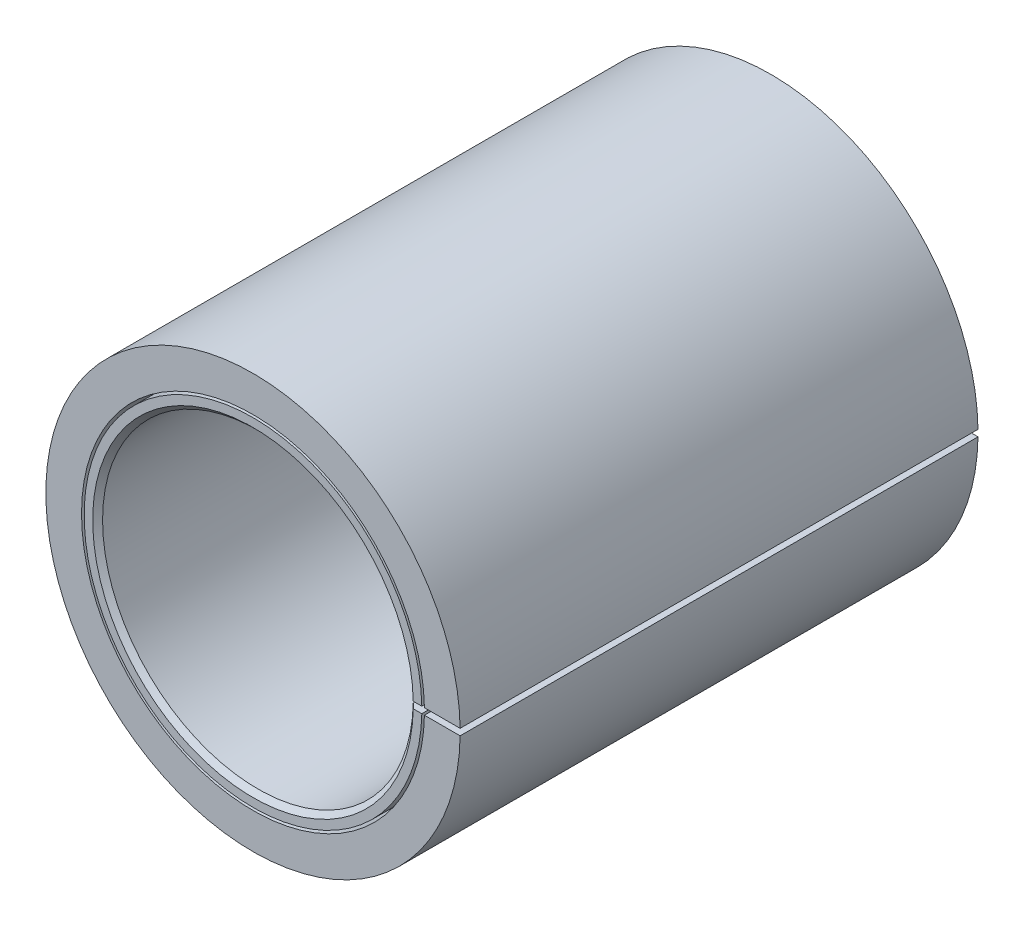
ISO-10303-21;
HEADER;
FILE_DESCRIPTION(('STEP AP214'),'2;1');
FILE_NAME('part.step','',(''),(''),'','','');
FILE_SCHEMA(('AUTOMOTIVE_DESIGN { 1 0 10303 214 1 1 1 1 }'));
ENDSEC;
DATA;
#1=APPLICATION_CONTEXT('core data for automotive mechanical design processes');
#2=APPLICATION_PROTOCOL_DEFINITION('international standard','automotive_design',2000,#1);
#3=PRODUCT_CONTEXT('',#1,'mechanical');
#4=PRODUCT('Part','Part','',(#3));
#5=PRODUCT_RELATED_PRODUCT_CATEGORY('part','',(#4));
#6=PRODUCT_DEFINITION_FORMATION('','',#4);
#7=PRODUCT_DEFINITION_CONTEXT('part definition',#1,'design');
#8=PRODUCT_DEFINITION('design','',#6,#7);
#9=PRODUCT_DEFINITION_SHAPE('','',#8);
#10=(LENGTH_UNIT() NAMED_UNIT(*) SI_UNIT(.MILLI.,.METRE.));
#11=(NAMED_UNIT(*) PLANE_ANGLE_UNIT() SI_UNIT($,.RADIAN.));
#12=(NAMED_UNIT(*) SI_UNIT($,.STERADIAN.) SOLID_ANGLE_UNIT());
#13=UNCERTAINTY_MEASURE_WITH_UNIT(LENGTH_MEASURE(1.E-05),#10,'distance_accuracy_value','');
#14=(GEOMETRIC_REPRESENTATION_CONTEXT(3) GLOBAL_UNCERTAINTY_ASSIGNED_CONTEXT((#13)) GLOBAL_UNIT_ASSIGNED_CONTEXT((#10,
#11,#12)) REPRESENTATION_CONTEXT('',''));
#15=CARTESIAN_POINT('',(0.,0.,0.));
#16=DIRECTION('',(0.,0.,1.));
#17=DIRECTION('',(1.,0.,0.));
#18=AXIS2_PLACEMENT_3D('',#15,#16,#17);
#19=CARTESIAN_POINT('',(0.,0.,5.));
#20=DIRECTION('',(0.,0.,-1.));
#21=DIRECTION('',(-1.,0.,0.));
#22=AXIS2_PLACEMENT_3D('',#19,#20,#21);
#23=CYLINDRICAL_SURFACE('',#22,4.);
#24=CARTESIAN_POINT('',(0.,0.,-5.));
#25=DIRECTION('',(0.,0.,1.));
#26=DIRECTION('',(1.,0.,0.));
#27=AXIS2_PLACEMENT_3D('',#24,#25,#26);
#28=CIRCLE('',#27,4.);
#29=CARTESIAN_POINT('',(3.99951168894404,0.0625,-5.));
#30=VERTEX_POINT('',#29);
#31=CARTESIAN_POINT('',(3.99951168894404,-0.0625,-5.));
#32=VERTEX_POINT('',#31);
#33=EDGE_CURVE('E115',#30,#32,#28,.T.);
#34=ORIENTED_EDGE('',*,*,#33,.T.);
#35=DIRECTION('',(0.,0.,-1.));
#36=VECTOR('',#35,1.);
#37=CARTESIAN_POINT('',(3.99951168894404,-0.0625,5.));
#38=LINE('',#37,#36);
#39=CARTESIAN_POINT('',(3.99951168894404,-0.0625,5.));
#40=VERTEX_POINT('',#39);
#41=EDGE_CURVE('E122',#32,#40,#38,.F.);
#42=ORIENTED_EDGE('',*,*,#41,.T.);
#43=CARTESIAN_POINT('',(0.,0.,5.));
#44=DIRECTION('',(0.,0.,1.));
#45=DIRECTION('',(1.,0.,0.));
#46=AXIS2_PLACEMENT_3D('',#43,#44,#45);
#47=CIRCLE('',#46,4.);
#48=CARTESIAN_POINT('',(3.99951168894404,0.0625,5.));
#49=VERTEX_POINT('',#48);
#50=EDGE_CURVE('E112',#49,#40,#47,.T.);
#51=ORIENTED_EDGE('',*,*,#50,.F.);
#52=DIRECTION('',(0.,0.,-1.));
#53=VECTOR('',#52,1.);
#54=CARTESIAN_POINT('',(3.99951168894404,0.0625,5.));
#55=LINE('',#54,#53);
#56=EDGE_CURVE('E125',#30,#49,#55,.F.);
#57=ORIENTED_EDGE('',*,*,#56,.F.);
#58=EDGE_LOOP('',(#34,#42,#51,#57));
#59=FACE_BOUND('',#58,.T.);
#60=ADVANCED_FACE('F61',(#59),#23,.T.);
#61=CARTESIAN_POINT('',(0.,0.,5.));
#62=DIRECTION('',(0.,0.,1.));
#63=DIRECTION('',(1.,0.,0.));
#64=AXIS2_PLACEMENT_3D('',#61,#62,#63);
#65=PLANE('',#64);
#66=DIRECTION('',(1.,0.,0.));
#67=VECTOR('',#66,1.);
#68=CARTESIAN_POINT('',(0.,-0.0625,5.));
#69=LINE('',#68,#67);
#70=CARTESIAN_POINT('',(3.31052436376191,-0.0625,5.));
#71=VERTEX_POINT('',#70);
#72=EDGE_CURVE('E100',#71,#40,#69,.T.);
#73=ORIENTED_EDGE('',*,*,#72,.F.);
#74=CARTESIAN_POINT('',(0.,0.,5.));
#75=DIRECTION('',(0.,0.,1.));
#76=DIRECTION('',(1.,0.,0.));
#77=AXIS2_PLACEMENT_3D('',#74,#75,#76);
#78=CIRCLE('',#77,3.31111428571429);
#79=CARTESIAN_POINT('',(3.31052436376191,0.0625,5.));
#80=VERTEX_POINT('',#79);
#81=EDGE_CURVE('E110',#80,#71,#78,.T.);
#82=ORIENTED_EDGE('',*,*,#81,.F.);
#83=DIRECTION('',(1.,0.,0.));
#84=VECTOR('',#83,1.);
#85=CARTESIAN_POINT('',(0.,0.0625,5.));
#86=LINE('',#85,#84);
#87=EDGE_CURVE('E76',#80,#49,#86,.T.);
#88=ORIENTED_EDGE('',*,*,#87,.T.);
#89=ORIENTED_EDGE('',*,*,#50,.T.);
#90=EDGE_LOOP('',(#73,#82,#88,#89));
#91=FACE_BOUND('',#90,.T.);
#92=ADVANCED_FACE('F109',(#91),#65,.T.);
#93=CARTESIAN_POINT('',(0.,0.,-5.));
#94=DIRECTION('',(0.,0.,1.));
#95=DIRECTION('',(1.,0.,0.));
#96=AXIS2_PLACEMENT_3D('',#93,#94,#95);
#97=PLANE('',#96);
#98=CARTESIAN_POINT('',(0.,0.,-5.));
#99=DIRECTION('',(0.,0.,1.));
#100=DIRECTION('',(1.,0.,0.));
#101=AXIS2_PLACEMENT_3D('',#98,#99,#100);
#102=CIRCLE('',#101,3.31111428571429);
#103=CARTESIAN_POINT('',(3.31052436376191,0.0625,-5.));
#104=VERTEX_POINT('',#103);
#105=CARTESIAN_POINT('',(3.31052436376191,-0.0625,-5.));
#106=VERTEX_POINT('',#105);
#107=EDGE_CURVE('E118',#104,#106,#102,.T.);
#108=ORIENTED_EDGE('',*,*,#107,.T.);
#109=DIRECTION('',(1.,0.,0.));
#110=VECTOR('',#109,1.);
#111=CARTESIAN_POINT('',(0.,-0.0625,-5.));
#112=LINE('',#111,#110);
#113=EDGE_CURVE('E84',#106,#32,#112,.T.);
#114=ORIENTED_EDGE('',*,*,#113,.T.);
#115=ORIENTED_EDGE('',*,*,#33,.F.);
#116=DIRECTION('',(1.,0.,0.));
#117=VECTOR('',#116,1.);
#118=CARTESIAN_POINT('',(0.,0.0625,-5.));
#119=LINE('',#118,#117);
#120=EDGE_CURVE('E127',#104,#30,#119,.T.);
#121=ORIENTED_EDGE('',*,*,#120,.F.);
#122=EDGE_LOOP('',(#108,#114,#115,#121));
#123=FACE_BOUND('',#122,.T.);
#124=ADVANCED_FACE('F63',(#123),#97,.F.);
#125=CARTESIAN_POINT('',(0.,0.,-5.));
#126=DIRECTION('',(0.,0.,1.));
#127=DIRECTION('',(1.,0.,0.));
#128=AXIS2_PLACEMENT_3D('',#125,#126,#127);
#129=CYLINDRICAL_SURFACE('',#128,3.31111428571429);
#130=ORIENTED_EDGE('',*,*,#81,.T.);
#131=DIRECTION('',(0.,0.,1.));
#132=VECTOR('',#131,1.);
#133=CARTESIAN_POINT('',(3.31052436376191,-0.0625,-5.));
#134=LINE('',#133,#132);
#135=EDGE_CURVE('E13',#71,#106,#134,.F.);
#136=ORIENTED_EDGE('',*,*,#135,.T.);
#137=ORIENTED_EDGE('',*,*,#107,.F.);
#138=DIRECTION('',(0.,0.,1.));
#139=VECTOR('',#138,1.);
#140=CARTESIAN_POINT('',(3.31052436376191,0.0625,-5.));
#141=LINE('',#140,#139);
#142=EDGE_CURVE('E69',#80,#104,#141,.F.);
#143=ORIENTED_EDGE('',*,*,#142,.F.);
#144=EDGE_LOOP('',(#130,#136,#137,#143));
#145=FACE_BOUND('',#144,.T.);
#146=ADVANCED_FACE('F114',(#145),#129,.F.);
#147=CARTESIAN_POINT('',(0.,0.0625,-5.));
#148=DIRECTION('',(0.,-1.,0.));
#149=DIRECTION('',(0.,0.,-1.));
#150=AXIS2_PLACEMENT_3D('',#147,#148,#149);
#151=PLANE('',#150);
#152=ORIENTED_EDGE('',*,*,#56,.T.);
#153=ORIENTED_EDGE('',*,*,#87,.F.);
#154=ORIENTED_EDGE('',*,*,#142,.T.);
#155=ORIENTED_EDGE('',*,*,#120,.T.);
#156=EDGE_LOOP('',(#152,#153,#154,#155));
#157=FACE_BOUND('',#156,.T.);
#158=ADVANCED_FACE('F135',(#157),#151,.T.);
#159=CARTESIAN_POINT('',(0.,-0.0625,-5.));
#160=DIRECTION('',(0.,-1.,0.));
#161=DIRECTION('',(0.,0.,-1.));
#162=AXIS2_PLACEMENT_3D('',#159,#160,#161);
#163=PLANE('',#162);
#164=ORIENTED_EDGE('',*,*,#113,.F.);
#165=ORIENTED_EDGE('',*,*,#135,.F.);
#166=ORIENTED_EDGE('',*,*,#72,.T.);
#167=ORIENTED_EDGE('',*,*,#41,.F.);
#168=EDGE_LOOP('',(#164,#165,#166,#167));
#169=FACE_BOUND('',#168,.T.);
#170=ADVANCED_FACE('F99',(#169),#163,.F.);
#171=CLOSED_SHELL('',(#60,#92,#124,#146,#158,#170));
#172=MANIFOLD_SOLID_BREP('B2',#171);
#173=CARTESIAN_POINT('',(0.,0.,5.));
#174=DIRECTION('',(0.,0.,1.));
#175=DIRECTION('',(1.,0.,0.));
#176=AXIS2_PLACEMENT_3D('',#173,#174,#175);
#177=PLANE('',#176);
#178=DIRECTION('',(1.,0.,0.));
#179=VECTOR('',#178,1.);
#180=CARTESIAN_POINT('',(0.,-0.0625,5.));
#181=LINE('',#180,#179);
#182=CARTESIAN_POINT('',(3.09460702128932,-0.0625,5.));
#183=VERTEX_POINT('',#182);
#184=CARTESIAN_POINT('',(3.25971517032281,-0.0625,5.));
#185=VERTEX_POINT('',#184);
#186=EDGE_CURVE('E242',#183,#185,#181,.T.);
#187=ORIENTED_EDGE('',*,*,#186,.F.);
#188=CARTESIAN_POINT('',(0.,0.,5.));
#189=DIRECTION('',(0.,0.,1.));
#190=DIRECTION('',(1.,0.,0.));
#191=AXIS2_PLACEMENT_3D('',#188,#189,#190);
#192=CIRCLE('',#191,3.0952380952381);
#193=CARTESIAN_POINT('',(3.09460702128932,0.0625,5.));
#194=VERTEX_POINT('',#193);
#195=EDGE_CURVE('E251',#183,#194,#192,.F.);
#196=ORIENTED_EDGE('',*,*,#195,.T.);
#197=DIRECTION('',(1.,0.,0.));
#198=VECTOR('',#197,1.);
#199=CARTESIAN_POINT('',(0.,0.0625,5.));
#200=LINE('',#199,#198);
#201=CARTESIAN_POINT('',(3.25971517032281,0.0625,5.));
#202=VERTEX_POINT('',#201);
#203=EDGE_CURVE('E213',#194,#202,#200,.T.);
#204=ORIENTED_EDGE('',*,*,#203,.T.);
#205=CARTESIAN_POINT('',(0.,0.,5.));
#206=DIRECTION('',(0.,0.,1.));
#207=DIRECTION('',(1.,0.,0.));
#208=AXIS2_PLACEMENT_3D('',#205,#206,#207);
#209=CIRCLE('',#208,3.26031428571429);
#210=EDGE_CURVE('E253',#202,#185,#209,.T.);
#211=ORIENTED_EDGE('',*,*,#210,.T.);
#212=EDGE_LOOP('',(#187,#196,#204,#211));
#213=FACE_BOUND('',#212,.T.);
#214=ADVANCED_FACE('F185',(#213),#177,.T.);
#215=CARTESIAN_POINT('',(0.,0.,5.));
#216=DIRECTION('',(0.,0.,-1.));
#217=DIRECTION('',(-1.,0.,0.));
#218=AXIS2_PLACEMENT_3D('',#215,#216,#217);
#219=CYLINDRICAL_SURFACE('',#218,3.);
#220=DIRECTION('',(0.,0.,-1.));
#221=VECTOR('',#220,1.);
#222=CARTESIAN_POINT('',(2.99934888767546,-0.0625,5.));
#223=LINE('',#222,#221);
#224=CARTESIAN_POINT('',(2.99934888767546,-0.0625,-4.90476190476191));
#225=VERTEX_POINT('',#224);
#226=CARTESIAN_POINT('',(2.99934888767546,-0.0625,4.9047619047619));
#227=VERTEX_POINT('',#226);
#228=EDGE_CURVE('E205',#225,#227,#223,.F.);
#229=ORIENTED_EDGE('',*,*,#228,.F.);
#230=CARTESIAN_POINT('',(0.,0.,-4.90476190476191));
#231=DIRECTION('',(0.,0.,1.));
#232=DIRECTION('',(1.,0.,0.));
#233=AXIS2_PLACEMENT_3D('',#230,#231,#232);
#234=CIRCLE('',#233,3.);
#235=CARTESIAN_POINT('',(2.99934888767546,0.0625,-4.90476190476191));
#236=VERTEX_POINT('',#235);
#237=EDGE_CURVE('E255',#225,#236,#234,.F.);
#238=ORIENTED_EDGE('',*,*,#237,.T.);
#239=DIRECTION('',(0.,0.,-1.));
#240=VECTOR('',#239,1.);
#241=CARTESIAN_POINT('',(2.99934888767546,0.0625,5.));
#242=LINE('',#241,#240);
#243=CARTESIAN_POINT('',(2.99934888767546,0.0625,4.9047619047619));
#244=VERTEX_POINT('',#243);
#245=EDGE_CURVE('E282',#236,#244,#242,.F.);
#246=ORIENTED_EDGE('',*,*,#245,.T.);
#247=CARTESIAN_POINT('',(0.,0.,4.9047619047619));
#248=DIRECTION('',(0.,0.,1.));
#249=DIRECTION('',(1.,0.,0.));
#250=AXIS2_PLACEMENT_3D('',#247,#248,#249);
#251=CIRCLE('',#250,3.);
#252=EDGE_CURVE('E258',#244,#227,#251,.T.);
#253=ORIENTED_EDGE('',*,*,#252,.T.);
#254=EDGE_LOOP('',(#229,#238,#246,#253));
#255=FACE_BOUND('',#254,.T.);
#256=ADVANCED_FACE('F311',(#255),#219,.F.);
#257=CARTESIAN_POINT('',(0.,0.,-5.));
#258=DIRECTION('',(0.,0.,1.));
#259=DIRECTION('',(1.,0.,0.));
#260=AXIS2_PLACEMENT_3D('',#257,#258,#259);
#261=PLANE('',#260);
#262=CARTESIAN_POINT('',(0.,0.,-5.));
#263=DIRECTION('',(0.,0.,1.));
#264=DIRECTION('',(1.,0.,0.));
#265=AXIS2_PLACEMENT_3D('',#262,#263,#264);
#266=CIRCLE('',#265,3.09523809523809);
#267=CARTESIAN_POINT('',(3.09460702128932,0.0625,-5.));
#268=VERTEX_POINT('',#267);
#269=CARTESIAN_POINT('',(3.09460702128932,-0.0625,-5.));
#270=VERTEX_POINT('',#269);
#271=EDGE_CURVE('E307',#268,#270,#266,.T.);
#272=ORIENTED_EDGE('',*,*,#271,.T.);
#273=DIRECTION('',(1.,0.,0.));
#274=VECTOR('',#273,1.);
#275=CARTESIAN_POINT('',(0.,-0.0625,-5.));
#276=LINE('',#275,#274);
#277=CARTESIAN_POINT('',(3.25971517032281,-0.0625,-5.));
#278=VERTEX_POINT('',#277);
#279=EDGE_CURVE('E314',#270,#278,#276,.T.);
#280=ORIENTED_EDGE('',*,*,#279,.T.);
#281=CARTESIAN_POINT('',(0.,0.,-5.));
#282=DIRECTION('',(0.,0.,1.));
#283=DIRECTION('',(1.,0.,0.));
#284=AXIS2_PLACEMENT_3D('',#281,#282,#283);
#285=CIRCLE('',#284,3.26031428571429);
#286=CARTESIAN_POINT('',(3.25971517032281,0.0625,-5.));
#287=VERTEX_POINT('',#286);
#288=EDGE_CURVE('E304',#287,#278,#285,.T.);
#289=ORIENTED_EDGE('',*,*,#288,.F.);
#290=DIRECTION('',(1.,0.,0.));
#291=VECTOR('',#290,1.);
#292=CARTESIAN_POINT('',(0.,0.0625,-5.));
#293=LINE('',#292,#291);
#294=EDGE_CURVE('E313',#268,#287,#293,.T.);
#295=ORIENTED_EDGE('',*,*,#294,.F.);
#296=EDGE_LOOP('',(#272,#280,#289,#295));
#297=FACE_BOUND('',#296,.T.);
#298=ADVANCED_FACE('F291',(#297),#261,.F.);
#299=CARTESIAN_POINT('',(0.,0.,-5.));
#300=DIRECTION('',(0.,0.,1.));
#301=DIRECTION('',(1.,0.,0.));
#302=AXIS2_PLACEMENT_3D('',#299,#300,#301);
#303=CYLINDRICAL_SURFACE('',#302,3.26031428571429);
#304=DIRECTION('',(0.,0.,1.));
#305=VECTOR('',#304,1.);
#306=CARTESIAN_POINT('',(3.25971517032281,-0.0625,-5.));
#307=LINE('',#306,#305);
#308=EDGE_CURVE('E301',#185,#278,#307,.F.);
#309=ORIENTED_EDGE('',*,*,#308,.F.);
#310=ORIENTED_EDGE('',*,*,#210,.F.);
#311=DIRECTION('',(0.,0.,1.));
#312=VECTOR('',#311,1.);
#313=CARTESIAN_POINT('',(3.25971517032281,0.0625,-5.));
#314=LINE('',#313,#312);
#315=EDGE_CURVE('E281',#202,#287,#314,.F.);
#316=ORIENTED_EDGE('',*,*,#315,.T.);
#317=ORIENTED_EDGE('',*,*,#288,.T.);
#318=EDGE_LOOP('',(#309,#310,#316,#317));
#319=FACE_BOUND('',#318,.T.);
#320=ADVANCED_FACE('F289',(#319),#303,.T.);
#321=CARTESIAN_POINT('',(0.,0.,-5.));
#322=DIRECTION('',(0.,0.,-1.));
#323=DIRECTION('',(-1.,0.,0.));
#324=AXIS2_PLACEMENT_3D('',#321,#322,#323);
#325=CONICAL_SURFACE('',#324,3.09523809523809,0.785398163397444);
#326=CARTESIAN_POINT('',(5.26222409702876,-0.0625,-7.16735714830385));
#327=CARTESIAN_POINT('',(4.86479746802348,-0.0625,-6.76996507359462));
#328=CARTESIAN_POINT('',(4.46737332790101,-0.0625,-6.37257050789148));
#329=CARTESIAN_POINT('',(3.67251007557288,-0.0625,-5.5777964288599));
#330=CARTESIAN_POINT('',(3.27507096336869,-0.0625,-5.18041691552997));
#331=CARTESIAN_POINT('',(2.67888600283048,-0.0625,-4.58437385980832));
#332=CARTESIAN_POINT('',(2.48015327960072,-0.0625,-4.38569718927698));
#333=CARTESIAN_POINT('',(2.08266996756869,-0.0625,-3.98836175374139));
#334=CARTESIAN_POINT('',(1.88391937876799,-0.0625,-3.78970298873556));
#335=CARTESIAN_POINT('',(1.58575964545878,-0.0625,-3.49174863613599));
#336=CARTESIAN_POINT('',(1.48636740683474,-0.0625,-3.39243613193995));
#337=CARTESIAN_POINT('',(1.28756202169668,-0.0625,-3.19383207966167));
#338=CARTESIAN_POINT('',(1.18814887518563,-0.0625,-3.09454053157648));
#339=CARTESIAN_POINT('',(0.989281413520054,-0.0625,-2.8959985602955));
#340=CARTESIAN_POINT('',(0.889827098344636,-0.0625,-2.79674813712063));
#341=CARTESIAN_POINT('',(0.740567376446871,-0.0625,-2.6479508971981));
#342=CARTESIAN_POINT('',(0.690801080663394,-0.0625,-2.59836486947287));
#343=CARTESIAN_POINT('',(0.591210998742803,-0.0625,-2.499250540729));
#344=CARTESIAN_POINT('',(0.541387212575795,-0.0625,-2.44972223974041));
#345=CARTESIAN_POINT('',(0.49151899890398,-0.0625,-2.400238620949));
#346=B_SPLINE_CURVE_WITH_KNOTS('',3,(#326,#327,#328,#329,#330,#331,#332,#333,#334,#335,#336,
#337,#338,#339,#340,#341,#342,#343,#344,#345),.UNSPECIFIED.,.F.,.F.,(4,2,2,2,2,2,2,2,2,4),(0.,
1.68606508968482,3.37213001315253,4.21516265313958,5.05819521891096,5.47971166436337,
5.90122805018618,6.32274465010214,6.53350306540142,6.74426159034229),.UNSPECIFIED.);
#347=EDGE_CURVE('E295',#270,#225,#346,.T.);
#348=ORIENTED_EDGE('',*,*,#347,.F.);
#349=ORIENTED_EDGE('',*,*,#271,.F.);
#350=CARTESIAN_POINT('',(5.26222409702876,0.0625,-7.16735714830385));
#351=CARTESIAN_POINT('',(4.86479746802348,0.0625,-6.76996507359462));
#352=CARTESIAN_POINT('',(4.46737332790101,0.0625,-6.37257050789148));
#353=CARTESIAN_POINT('',(3.67251007557288,0.0625,-5.5777964288599));
#354=CARTESIAN_POINT('',(3.27507096336869,0.0625,-5.18041691552997));
#355=CARTESIAN_POINT('',(2.67888600283048,0.0625,-4.58437385980832));
#356=CARTESIAN_POINT('',(2.48015327960072,0.0625,-4.38569718927698));
#357=CARTESIAN_POINT('',(2.08266996756869,0.0625,-3.98836175374139));
#358=CARTESIAN_POINT('',(1.88391937876799,0.0625,-3.78970298873556));
#359=CARTESIAN_POINT('',(1.58575964545878,0.0625,-3.49174863613599));
#360=CARTESIAN_POINT('',(1.48636740683474,0.0625,-3.39243613193995));
#361=CARTESIAN_POINT('',(1.28756202169668,0.0625,-3.19383207966167));
#362=CARTESIAN_POINT('',(1.18814887518563,0.0625,-3.09454053157648));
#363=CARTESIAN_POINT('',(0.989281413520054,0.0625,-2.8959985602955));
#364=CARTESIAN_POINT('',(0.889827098344636,0.0625,-2.79674813712063));
#365=CARTESIAN_POINT('',(0.740567376446871,0.0625,-2.6479508971981));
#366=CARTESIAN_POINT('',(0.690801080663394,0.0625,-2.59836486947287));
#367=CARTESIAN_POINT('',(0.591210998742803,0.0625,-2.499250540729));
#368=CARTESIAN_POINT('',(0.541387212575795,0.0625,-2.44972223974041));
#369=CARTESIAN_POINT('',(0.49151899890398,0.0625,-2.400238620949));
#370=B_SPLINE_CURVE_WITH_KNOTS('',3,(#350,#351,#352,#353,#354,#355,#356,#357,#358,#359,#360,
#361,#362,#363,#364,#365,#366,#367,#368,#369),.UNSPECIFIED.,.F.,.F.,(4,2,2,2,2,2,2,2,2,4),(0.,
1.68606508968482,3.37213001315253,4.21516265313958,5.05819521891096,5.47971166436337,
5.90122805018618,6.32274465010214,6.53350306540142,6.74426159034229),.UNSPECIFIED.);
#371=EDGE_CURVE('E273',#268,#236,#370,.T.);
#372=ORIENTED_EDGE('',*,*,#371,.T.);
#373=ORIENTED_EDGE('',*,*,#237,.F.);
#374=EDGE_LOOP('',(#348,#349,#372,#373));
#375=FACE_BOUND('',#374,.T.);
#376=ADVANCED_FACE('F285',(#375),#325,.F.);
#377=CARTESIAN_POINT('',(0.,0.,4.9047619047619));
#378=DIRECTION('',(0.,0.,1.));
#379=DIRECTION('',(1.,0.,0.));
#380=AXIS2_PLACEMENT_3D('',#377,#378,#379);
#381=CONICAL_SURFACE('',#380,3.,0.785398163397442);
#382=CARTESIAN_POINT('',(0.491518998903983,-0.0625,2.40023862094899));
#383=CARTESIAN_POINT('',(0.560187567910804,-0.0625,2.46839161032718));
#384=CARTESIAN_POINT('',(0.628782244653796,-0.0625,2.53661885480079));
#385=CARTESIAN_POINT('',(0.765883775480807,-0.0625,2.6731614696388));
#386=CARTESIAN_POINT('',(0.834390629617392,-0.0625,2.74147683995041));
#387=CARTESIAN_POINT('',(1.17685502994548,-0.0625,3.08312282729555));
#388=CARTESIAN_POINT('',(1.45060423664492,-0.0625,3.35666211885004));
#389=CARTESIAN_POINT('',(1.99805653821632,-0.0625,3.90378709409841));
#390=CARTESIAN_POINT('',(2.27175963306064,-0.0625,4.17737277781992));
#391=CARTESIAN_POINT('',(2.65617106832955,-0.0625,4.56166615353346));
#392=CARTESIAN_POINT('',(2.76689335012523,-0.0625,4.6723598894875));
#393=CARTESIAN_POINT('',(3.27507017828085,-0.0625,5.18041745874119));
#394=CARTESIAN_POINT('',(3.67250949990346,-0.0625,5.57779651736323));
#395=CARTESIAN_POINT('',(4.46737341523824,-0.0625,6.37256993111295));
#396=CARTESIAN_POINT('',(4.8647980089397,-0.0625,6.76996428625133));
#397=CARTESIAN_POINT('',(5.26222409702876,-0.0625,7.16735714830386));
#398=B_SPLINE_CURVE_WITH_KNOTS('',3,(#382,#383,#384,#385,#386,#387,#388,#389,#390,#391,#392,
#393,#394,#395,#396,#397),.UNSPECIFIED.,.F.,.F.,(4,2,2,2,2,2,2,4),(0.,0.29024416850559,
0.580488163200358,1.74146234682284,2.90243722423135,3.37213152925102,5.05819593479444,
6.74426154240355),.UNSPECIFIED.);
#399=EDGE_CURVE('E59',#227,#183,#398,.T.);
#400=ORIENTED_EDGE('',*,*,#399,.F.);
#401=ORIENTED_EDGE('',*,*,#252,.F.);
#402=CARTESIAN_POINT('',(0.491518998903983,0.0625,2.40023862094899));
#403=CARTESIAN_POINT('',(0.560187567910804,0.0625,2.46839161032718));
#404=CARTESIAN_POINT('',(0.628782244653796,0.0625,2.53661885480079));
#405=CARTESIAN_POINT('',(0.765883775480807,0.0625,2.6731614696388));
#406=CARTESIAN_POINT('',(0.834390629617392,0.0625,2.74147683995041));
#407=CARTESIAN_POINT('',(1.17685502994548,0.0625,3.08312282729555));
#408=CARTESIAN_POINT('',(1.45060423664492,0.0625,3.35666211885004));
#409=CARTESIAN_POINT('',(1.99805653821632,0.0625,3.90378709409841));
#410=CARTESIAN_POINT('',(2.27175963306064,0.0625,4.17737277781992));
#411=CARTESIAN_POINT('',(2.65617106832955,0.0625,4.56166615353346));
#412=CARTESIAN_POINT('',(2.76689335012523,0.0625,4.6723598894875));
#413=CARTESIAN_POINT('',(3.27507017828085,0.0625,5.18041745874119));
#414=CARTESIAN_POINT('',(3.67250949990346,0.0625,5.57779651736323));
#415=CARTESIAN_POINT('',(4.46737341523824,0.0625,6.37256993111295));
#416=CARTESIAN_POINT('',(4.8647980089397,0.0625,6.76996428625133));
#417=CARTESIAN_POINT('',(5.26222409702876,0.0625,7.16735714830386));
#418=B_SPLINE_CURVE_WITH_KNOTS('',3,(#402,#403,#404,#405,#406,#407,#408,#409,#410,#411,#412,
#413,#414,#415,#416,#417),.UNSPECIFIED.,.F.,.F.,(4,2,2,2,2,2,2,4),(0.,0.29024416850559,
0.580488163200358,1.74146234682284,2.90243722423135,3.37213152925102,5.05819593479444,
6.74426154240355),.UNSPECIFIED.);
#419=EDGE_CURVE('E199',#244,#194,#418,.T.);
#420=ORIENTED_EDGE('',*,*,#419,.T.);
#421=ORIENTED_EDGE('',*,*,#195,.F.);
#422=EDGE_LOOP('',(#400,#401,#420,#421));
#423=FACE_BOUND('',#422,.T.);
#424=ADVANCED_FACE('F187',(#423),#381,.F.);
#425=CARTESIAN_POINT('',(0.,0.0625,-5.));
#426=DIRECTION('',(0.,-1.,0.));
#427=DIRECTION('',(0.,0.,-1.));
#428=AXIS2_PLACEMENT_3D('',#425,#426,#427);
#429=PLANE('',#428);
#430=ORIENTED_EDGE('',*,*,#203,.F.);
#431=ORIENTED_EDGE('',*,*,#419,.F.);
#432=ORIENTED_EDGE('',*,*,#245,.F.);
#433=ORIENTED_EDGE('',*,*,#371,.F.);
#434=ORIENTED_EDGE('',*,*,#294,.T.);
#435=ORIENTED_EDGE('',*,*,#315,.F.);
#436=EDGE_LOOP('',(#430,#431,#432,#433,#434,#435));
#437=FACE_BOUND('',#436,.T.);
#438=ADVANCED_FACE('F266',(#437),#429,.T.);
#439=CARTESIAN_POINT('',(0.,-0.0625,-5.));
#440=DIRECTION('',(0.,-1.,0.));
#441=DIRECTION('',(0.,0.,-1.));
#442=AXIS2_PLACEMENT_3D('',#439,#440,#441);
#443=PLANE('',#442);
#444=ORIENTED_EDGE('',*,*,#308,.T.);
#445=ORIENTED_EDGE('',*,*,#279,.F.);
#446=ORIENTED_EDGE('',*,*,#347,.T.);
#447=ORIENTED_EDGE('',*,*,#228,.T.);
#448=ORIENTED_EDGE('',*,*,#399,.T.);
#449=ORIENTED_EDGE('',*,*,#186,.T.);
#450=EDGE_LOOP('',(#444,#445,#446,#447,#448,#449));
#451=FACE_BOUND('',#450,.T.);
#452=ADVANCED_FACE('F241',(#451),#443,.F.);
#453=CLOSED_SHELL('',(#214,#256,#298,#320,#376,#424,#438,#452));
#454=MANIFOLD_SOLID_BREP('B7',#453);
#455=ADVANCED_BREP_SHAPE_REPRESENTATION('',(#18,#172,#454),#14);
#456=SHAPE_DEFINITION_REPRESENTATION(#9,#455);
ENDSEC;
END-ISO-10303-21;
